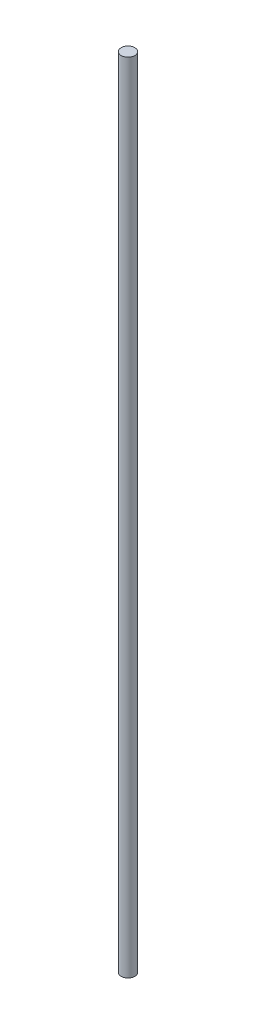
ISO-10303-21;
HEADER;
FILE_DESCRIPTION(('STEP AP214'),'2;1');
FILE_NAME('part.step','',(''),(''),'','','');
FILE_SCHEMA(('AUTOMOTIVE_DESIGN { 1 0 10303 214 1 1 1 1 }'));
ENDSEC;
DATA;
#1=APPLICATION_CONTEXT('core data for automotive mechanical design processes');
#2=APPLICATION_PROTOCOL_DEFINITION('international standard','automotive_design',2000,#1);
#3=PRODUCT_CONTEXT('',#1,'mechanical');
#4=PRODUCT('Part','Part','',(#3));
#5=PRODUCT_RELATED_PRODUCT_CATEGORY('part','',(#4));
#6=PRODUCT_DEFINITION_FORMATION('','',#4);
#7=PRODUCT_DEFINITION_CONTEXT('part definition',#1,'design');
#8=PRODUCT_DEFINITION('design','',#6,#7);
#9=PRODUCT_DEFINITION_SHAPE('','',#8);
#10=(LENGTH_UNIT() NAMED_UNIT(*) SI_UNIT(.MILLI.,.METRE.));
#11=(NAMED_UNIT(*) PLANE_ANGLE_UNIT() SI_UNIT($,.RADIAN.));
#12=(NAMED_UNIT(*) SI_UNIT($,.STERADIAN.) SOLID_ANGLE_UNIT());
#13=UNCERTAINTY_MEASURE_WITH_UNIT(LENGTH_MEASURE(1.E-05),#10,'distance_accuracy_value','');
#14=(GEOMETRIC_REPRESENTATION_CONTEXT(3) GLOBAL_UNCERTAINTY_ASSIGNED_CONTEXT((#13)) GLOBAL_UNIT_ASSIGNED_CONTEXT((#10,
#11,#12)) REPRESENTATION_CONTEXT('',''));
#15=CARTESIAN_POINT('',(0.,0.,0.));
#16=DIRECTION('',(0.,0.,1.));
#17=DIRECTION('',(1.,0.,0.));
#18=AXIS2_PLACEMENT_3D('',#15,#16,#17);
#19=CARTESIAN_POINT('',(0.,350.,0.));
#20=DIRECTION('',(0.,-1.,0.));
#21=DIRECTION('',(0.,0.,-1.));
#22=AXIS2_PLACEMENT_3D('',#19,#20,#21);
#23=CYLINDRICAL_SURFACE('',#22,3.);
#24=CARTESIAN_POINT('',(0.,350.,0.));
#25=DIRECTION('',(0.,1.,0.));
#26=DIRECTION('',(0.,0.,1.));
#27=AXIS2_PLACEMENT_3D('',#24,#25,#26);
#28=CIRCLE('',#27,3.);
#29=CARTESIAN_POINT('',(0.,350.,3.));
#30=VERTEX_POINT('',#29);
#31=EDGE_CURVE('E10',#30,#30,#28,.T.);
#32=ORIENTED_EDGE('',*,*,#31,.F.);
#33=EDGE_LOOP('',(#32));
#34=FACE_BOUND('',#33,.T.);
#35=CARTESIAN_POINT('',(0.,0.,0.));
#36=DIRECTION('',(0.,1.,0.));
#37=DIRECTION('',(0.,0.,1.));
#38=AXIS2_PLACEMENT_3D('',#35,#36,#37);
#39=CIRCLE('',#38,3.);
#40=CARTESIAN_POINT('',(0.,0.,3.));
#41=VERTEX_POINT('',#40);
#42=EDGE_CURVE('E34',#41,#41,#39,.T.);
#43=ORIENTED_EDGE('',*,*,#42,.T.);
#44=EDGE_LOOP('',(#43));
#45=FACE_BOUND('',#44,.T.);
#46=ADVANCED_FACE('F31',(#34,#45),#23,.T.);
#47=CARTESIAN_POINT('',(0.,350.,0.));
#48=DIRECTION('',(0.,1.,0.));
#49=DIRECTION('',(0.,0.,1.));
#50=AXIS2_PLACEMENT_3D('',#47,#48,#49);
#51=PLANE('',#50);
#52=ORIENTED_EDGE('',*,*,#31,.T.);
#53=EDGE_LOOP('',(#52));
#54=FACE_BOUND('',#53,.T.);
#55=ADVANCED_FACE('F46',(#54),#51,.T.);
#56=CARTESIAN_POINT('',(0.,0.,0.));
#57=DIRECTION('',(0.,1.,0.));
#58=DIRECTION('',(0.,0.,1.));
#59=AXIS2_PLACEMENT_3D('',#56,#57,#58);
#60=PLANE('',#59);
#61=ORIENTED_EDGE('',*,*,#42,.F.);
#62=EDGE_LOOP('',(#61));
#63=FACE_BOUND('',#62,.T.);
#64=ADVANCED_FACE('F44',(#63),#60,.F.);
#65=CLOSED_SHELL('',(#46,#55,#64));
#66=MANIFOLD_SOLID_BREP('B2',#65);
#67=ADVANCED_BREP_SHAPE_REPRESENTATION('',(#18,#66),#14);
#68=SHAPE_DEFINITION_REPRESENTATION(#9,#67);
ENDSEC;
END-ISO-10303-21;
